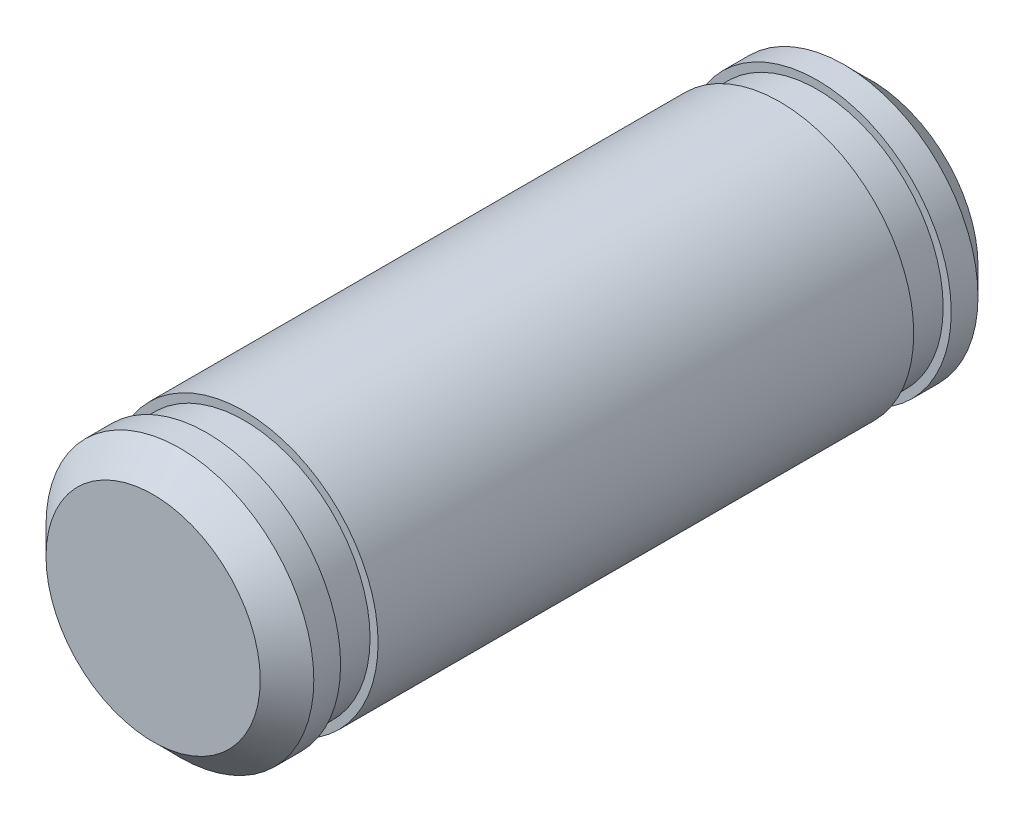
ISO-10303-21;
HEADER;
FILE_DESCRIPTION(('STEP AP214'),'2;1');
FILE_NAME('part.step','',(''),(''),'','','');
FILE_SCHEMA(('AUTOMOTIVE_DESIGN { 1 0 10303 214 1 1 1 1 }'));
ENDSEC;
DATA;
#1=APPLICATION_CONTEXT('core data for automotive mechanical design processes');
#2=APPLICATION_PROTOCOL_DEFINITION('international standard','automotive_design',2000,#1);
#3=PRODUCT_CONTEXT('',#1,'mechanical');
#4=PRODUCT('Part','Part','',(#3));
#5=PRODUCT_RELATED_PRODUCT_CATEGORY('part','',(#4));
#6=PRODUCT_DEFINITION_FORMATION('','',#4);
#7=PRODUCT_DEFINITION_CONTEXT('part definition',#1,'design');
#8=PRODUCT_DEFINITION('design','',#6,#7);
#9=PRODUCT_DEFINITION_SHAPE('','',#8);
#10=(LENGTH_UNIT() NAMED_UNIT(*) SI_UNIT(.MILLI.,.METRE.));
#11=(NAMED_UNIT(*) PLANE_ANGLE_UNIT() SI_UNIT($,.RADIAN.));
#12=(NAMED_UNIT(*) SI_UNIT($,.STERADIAN.) SOLID_ANGLE_UNIT());
#13=UNCERTAINTY_MEASURE_WITH_UNIT(LENGTH_MEASURE(1.E-05),#10,'distance_accuracy_value','');
#14=(GEOMETRIC_REPRESENTATION_CONTEXT(3) GLOBAL_UNCERTAINTY_ASSIGNED_CONTEXT((#13)) GLOBAL_UNIT_ASSIGNED_CONTEXT((#10,
#11,#12)) REPRESENTATION_CONTEXT('',''));
#15=CARTESIAN_POINT('',(0.,0.,0.));
#16=DIRECTION('',(0.,0.,1.));
#17=DIRECTION('',(1.,0.,0.));
#18=AXIS2_PLACEMENT_3D('',#15,#16,#17);
#19=CARTESIAN_POINT('',(0.,0.,13.4));
#20=DIRECTION('',(0.,0.,-1.));
#21=DIRECTION('',(-1.,0.,0.));
#22=AXIS2_PLACEMENT_3D('',#19,#20,#21);
#23=CYLINDRICAL_SURFACE('',#22,2.5);
#24=CARTESIAN_POINT('',(0.,0.,11.7));
#25=DIRECTION('',(0.,0.,1.));
#26=DIRECTION('',(1.,0.,0.));
#27=AXIS2_PLACEMENT_3D('',#24,#25,#26);
#28=CIRCLE('',#27,2.5);
#29=CARTESIAN_POINT('',(2.5,0.,11.7));
#30=VERTEX_POINT('',#29);
#31=EDGE_CURVE('E54',#30,#30,#28,.T.);
#32=ORIENTED_EDGE('',*,*,#31,.F.);
#33=EDGE_LOOP('',(#32));
#34=FACE_BOUND('',#33,.T.);
#35=CARTESIAN_POINT('',(0.,0.,1.7));
#36=DIRECTION('',(0.,0.,-1.));
#37=DIRECTION('',(-1.,0.,0.));
#38=AXIS2_PLACEMENT_3D('',#35,#36,#37);
#39=CIRCLE('',#38,2.5);
#40=CARTESIAN_POINT('',(-2.5,0.,1.7));
#41=VERTEX_POINT('',#40);
#42=EDGE_CURVE('E64',#41,#41,#39,.T.);
#43=ORIENTED_EDGE('',*,*,#42,.F.);
#44=EDGE_LOOP('',(#43));
#45=FACE_BOUND('',#44,.T.);
#46=ADVANCED_FACE('F33',(#34,#45),#23,.T.);
#47=CARTESIAN_POINT('',(0.,0.,11.7));
#48=DIRECTION('',(0.,0.,1.));
#49=DIRECTION('',(1.,0.,0.));
#50=AXIS2_PLACEMENT_3D('',#47,#48,#49);
#51=PLANE('',#50);
#52=CARTESIAN_POINT('',(0.,0.,11.7));
#53=DIRECTION('',(0.,0.,1.));
#54=DIRECTION('',(1.,0.,0.));
#55=AXIS2_PLACEMENT_3D('',#52,#53,#54);
#56=CIRCLE('',#55,2.35);
#57=CARTESIAN_POINT('',(2.35,0.,11.7));
#58=VERTEX_POINT('',#57);
#59=EDGE_CURVE('E58',#58,#58,#56,.T.);
#60=ORIENTED_EDGE('',*,*,#59,.F.);
#61=EDGE_LOOP('',(#60));
#62=FACE_BOUND('',#61,.T.);
#63=ORIENTED_EDGE('',*,*,#31,.T.);
#64=EDGE_LOOP('',(#63));
#65=FACE_BOUND('',#64,.T.);
#66=ADVANCED_FACE('F91',(#62,#65),#51,.T.);
#67=CARTESIAN_POINT('',(0.,0.,12.4));
#68=DIRECTION('',(0.,0.,1.));
#69=DIRECTION('',(1.,0.,0.));
#70=AXIS2_PLACEMENT_3D('',#67,#68,#69);
#71=PLANE('',#70);
#72=CARTESIAN_POINT('',(0.,0.,12.4));
#73=DIRECTION('',(0.,0.,1.));
#74=DIRECTION('',(1.,0.,0.));
#75=AXIS2_PLACEMENT_3D('',#72,#73,#74);
#76=CIRCLE('',#75,2.35);
#77=CARTESIAN_POINT('',(2.35,0.,12.4));
#78=VERTEX_POINT('',#77);
#79=EDGE_CURVE('E61',#78,#78,#76,.T.);
#80=ORIENTED_EDGE('',*,*,#79,.T.);
#81=EDGE_LOOP('',(#80));
#82=FACE_BOUND('',#81,.T.);
#83=CARTESIAN_POINT('',(0.,0.,12.4));
#84=DIRECTION('',(0.,0.,1.));
#85=DIRECTION('',(1.,0.,0.));
#86=AXIS2_PLACEMENT_3D('',#83,#84,#85);
#87=CIRCLE('',#86,2.5);
#88=CARTESIAN_POINT('',(2.5,0.,12.4));
#89=VERTEX_POINT('',#88);
#90=EDGE_CURVE('E55',#89,#89,#87,.T.);
#91=ORIENTED_EDGE('',*,*,#90,.F.);
#92=EDGE_LOOP('',(#91));
#93=FACE_BOUND('',#92,.T.);
#94=ADVANCED_FACE('F98',(#82,#93),#71,.F.);
#95=CARTESIAN_POINT('',(0.,0.,11.7));
#96=DIRECTION('',(0.,0.,1.));
#97=DIRECTION('',(1.,0.,0.));
#98=AXIS2_PLACEMENT_3D('',#95,#96,#97);
#99=CYLINDRICAL_SURFACE('',#98,2.35);
#100=ORIENTED_EDGE('',*,*,#59,.T.);
#101=EDGE_LOOP('',(#100));
#102=FACE_BOUND('',#101,.T.);
#103=ORIENTED_EDGE('',*,*,#79,.F.);
#104=EDGE_LOOP('',(#103));
#105=FACE_BOUND('',#104,.T.);
#106=ADVANCED_FACE('F119',(#102,#105),#99,.T.);
#107=CARTESIAN_POINT('',(0.,0.,13.4));
#108=DIRECTION('',(0.,0.,1.));
#109=DIRECTION('',(1.,0.,0.));
#110=AXIS2_PLACEMENT_3D('',#107,#108,#109);
#111=PLANE('',#110);
#112=CARTESIAN_POINT('',(0.,0.,13.4));
#113=DIRECTION('',(0.,0.,1.));
#114=DIRECTION('',(1.,0.,0.));
#115=AXIS2_PLACEMENT_3D('',#112,#113,#114);
#116=CIRCLE('',#115,2.);
#117=CARTESIAN_POINT('',(2.,0.,13.4));
#118=VERTEX_POINT('',#117);
#119=EDGE_CURVE('E10',#118,#118,#116,.T.);
#120=ORIENTED_EDGE('',*,*,#119,.T.);
#121=EDGE_LOOP('',(#120));
#122=FACE_BOUND('',#121,.T.);
#123=ADVANCED_FACE('F111',(#122),#111,.T.);
#124=CARTESIAN_POINT('',(0.,0.,13.4));
#125=DIRECTION('',(0.,0.,-1.));
#126=DIRECTION('',(-1.,0.,0.));
#127=AXIS2_PLACEMENT_3D('',#124,#125,#126);
#128=CONICAL_SURFACE('',#127,2.,0.785398163397446);
#129=CARTESIAN_POINT('',(0.,0.,12.9));
#130=DIRECTION('',(0.,0.,1.));
#131=DIRECTION('',(1.,0.,0.));
#132=AXIS2_PLACEMENT_3D('',#129,#130,#131);
#133=CIRCLE('',#132,2.5);
#134=CARTESIAN_POINT('',(2.5,0.,12.9));
#135=VERTEX_POINT('',#134);
#136=EDGE_CURVE('E49',#135,#135,#133,.F.);
#137=ORIENTED_EDGE('',*,*,#136,.F.);
#138=EDGE_LOOP('',(#137));
#139=FACE_BOUND('',#138,.T.);
#140=ORIENTED_EDGE('',*,*,#119,.F.);
#141=EDGE_LOOP('',(#140));
#142=FACE_BOUND('',#141,.T.);
#143=ADVANCED_FACE('F36',(#139,#142),#128,.T.);
#144=ORIENTED_EDGE('',*,*,#90,.T.);
#145=EDGE_LOOP('',(#144));
#146=FACE_BOUND('',#145,.T.);
#147=ORIENTED_EDGE('',*,*,#136,.T.);
#148=EDGE_LOOP('',(#147));
#149=FACE_BOUND('',#148,.T.);
#150=ADVANCED_FACE('F86',(#146,#149),#23,.T.);
#151=CARTESIAN_POINT('',(0.,0.,1.7));
#152=DIRECTION('',(0.,0.,-1.));
#153=DIRECTION('',(-1.,0.,0.));
#154=AXIS2_PLACEMENT_3D('',#151,#152,#153);
#155=PLANE('',#154);
#156=CARTESIAN_POINT('',(0.,0.,1.7));
#157=DIRECTION('',(0.,0.,-1.));
#158=DIRECTION('',(-1.,0.,0.));
#159=AXIS2_PLACEMENT_3D('',#156,#157,#158);
#160=CIRCLE('',#159,2.35);
#161=CARTESIAN_POINT('',(-2.35,0.,1.7));
#162=VERTEX_POINT('',#161);
#163=EDGE_CURVE('E70',#162,#162,#160,.T.);
#164=ORIENTED_EDGE('',*,*,#163,.F.);
#165=EDGE_LOOP('',(#164));
#166=FACE_BOUND('',#165,.T.);
#167=ORIENTED_EDGE('',*,*,#42,.T.);
#168=EDGE_LOOP('',(#167));
#169=FACE_BOUND('',#168,.T.);
#170=ADVANCED_FACE('F82',(#166,#169),#155,.T.);
#171=CARTESIAN_POINT('',(0.,0.,1.));
#172=DIRECTION('',(0.,0.,-1.));
#173=DIRECTION('',(-1.,0.,0.));
#174=AXIS2_PLACEMENT_3D('',#171,#172,#173);
#175=PLANE('',#174);
#176=CARTESIAN_POINT('',(0.,0.,1.));
#177=DIRECTION('',(0.,0.,-1.));
#178=DIRECTION('',(-1.,0.,0.));
#179=AXIS2_PLACEMENT_3D('',#176,#177,#178);
#180=CIRCLE('',#179,2.35);
#181=CARTESIAN_POINT('',(-2.35,0.,1.));
#182=VERTEX_POINT('',#181);
#183=EDGE_CURVE('E73',#182,#182,#180,.T.);
#184=ORIENTED_EDGE('',*,*,#183,.T.);
#185=EDGE_LOOP('',(#184));
#186=FACE_BOUND('',#185,.T.);
#187=CARTESIAN_POINT('',(0.,0.,1.));
#188=DIRECTION('',(0.,0.,-1.));
#189=DIRECTION('',(-1.,0.,0.));
#190=AXIS2_PLACEMENT_3D('',#187,#188,#189);
#191=CIRCLE('',#190,2.5);
#192=CARTESIAN_POINT('',(-2.5,0.,1.));
#193=VERTEX_POINT('',#192);
#194=EDGE_CURVE('E67',#193,#193,#191,.T.);
#195=ORIENTED_EDGE('',*,*,#194,.F.);
#196=EDGE_LOOP('',(#195));
#197=FACE_BOUND('',#196,.T.);
#198=ADVANCED_FACE('F85',(#186,#197),#175,.F.);
#199=CARTESIAN_POINT('',(0.,0.,1.7));
#200=DIRECTION('',(0.,0.,-1.));
#201=DIRECTION('',(-1.,0.,0.));
#202=AXIS2_PLACEMENT_3D('',#199,#200,#201);
#203=CYLINDRICAL_SURFACE('',#202,2.35);
#204=ORIENTED_EDGE('',*,*,#163,.T.);
#205=EDGE_LOOP('',(#204));
#206=FACE_BOUND('',#205,.T.);
#207=ORIENTED_EDGE('',*,*,#183,.F.);
#208=EDGE_LOOP('',(#207));
#209=FACE_BOUND('',#208,.T.);
#210=ADVANCED_FACE('F79',(#206,#209),#203,.T.);
#211=CARTESIAN_POINT('',(0.,0.,0.));
#212=DIRECTION('',(0.,0.,1.));
#213=DIRECTION('',(1.,0.,0.));
#214=AXIS2_PLACEMENT_3D('',#211,#212,#213);
#215=PLANE('',#214);
#216=CARTESIAN_POINT('',(0.,0.,0.));
#217=DIRECTION('',(0.,0.,1.));
#218=DIRECTION('',(1.,0.,0.));
#219=AXIS2_PLACEMENT_3D('',#216,#217,#218);
#220=CIRCLE('',#219,2.);
#221=CARTESIAN_POINT('',(2.,0.,0.));
#222=VERTEX_POINT('',#221);
#223=EDGE_CURVE('E41',#222,#222,#220,.F.);
#224=ORIENTED_EDGE('',*,*,#223,.T.);
#225=EDGE_LOOP('',(#224));
#226=FACE_BOUND('',#225,.T.);
#227=ADVANCED_FACE('F129',(#226),#215,.F.);
#228=CARTESIAN_POINT('',(0.,0.,0.5));
#229=DIRECTION('',(0.,0.,1.));
#230=DIRECTION('',(1.,0.,0.));
#231=AXIS2_PLACEMENT_3D('',#228,#229,#230);
#232=CONICAL_SURFACE('',#231,2.5,0.785398163397448);
#233=ORIENTED_EDGE('',*,*,#223,.F.);
#234=EDGE_LOOP('',(#233));
#235=FACE_BOUND('',#234,.T.);
#236=CARTESIAN_POINT('',(0.,0.,0.5));
#237=DIRECTION('',(0.,0.,1.));
#238=DIRECTION('',(1.,0.,0.));
#239=AXIS2_PLACEMENT_3D('',#236,#237,#238);
#240=CIRCLE('',#239,2.5);
#241=CARTESIAN_POINT('',(2.5,0.,0.5));
#242=VERTEX_POINT('',#241);
#243=EDGE_CURVE('E45',#242,#242,#240,.T.);
#244=ORIENTED_EDGE('',*,*,#243,.F.);
#245=EDGE_LOOP('',(#244));
#246=FACE_BOUND('',#245,.T.);
#247=ADVANCED_FACE('F104',(#235,#246),#232,.T.);
#248=ORIENTED_EDGE('',*,*,#194,.T.);
#249=EDGE_LOOP('',(#248));
#250=FACE_BOUND('',#249,.T.);
#251=ORIENTED_EDGE('',*,*,#243,.T.);
#252=EDGE_LOOP('',(#251));
#253=FACE_BOUND('',#252,.T.);
#254=ADVANCED_FACE('F94',(#250,#253),#23,.T.);
#255=CLOSED_SHELL('',(#46,#66,#94,#106,#123,#143,#150,#170,#198,#210,#227,#247,#254));
#256=MANIFOLD_SOLID_BREP('B2',#255);
#257=ADVANCED_BREP_SHAPE_REPRESENTATION('',(#18,#256),#14);
#258=SHAPE_DEFINITION_REPRESENTATION(#9,#257);
ENDSEC;
END-ISO-10303-21;
